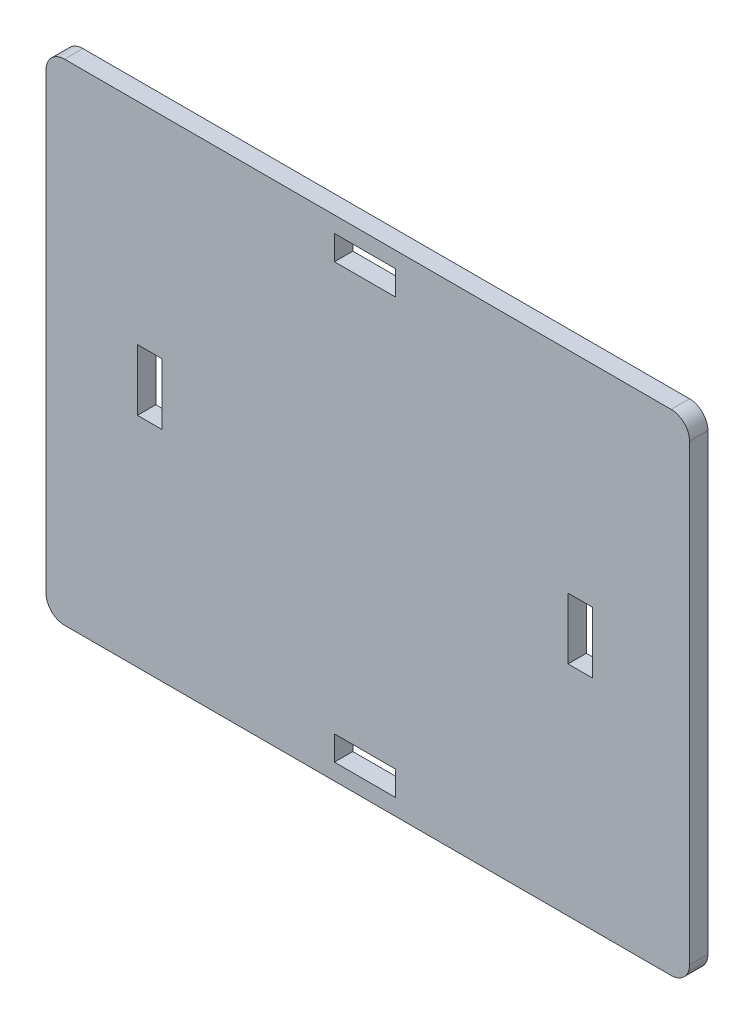
ISO-10303-21;
HEADER;
FILE_DESCRIPTION(('STEP AP214'),'2;1');
FILE_NAME('part.step','',(''),(''),'','','');
FILE_SCHEMA(('AUTOMOTIVE_DESIGN { 1 0 10303 214 1 1 1 1 }'));
ENDSEC;
DATA;
#1=APPLICATION_CONTEXT('core data for automotive mechanical design processes');
#2=APPLICATION_PROTOCOL_DEFINITION('international standard','automotive_design',2000,#1);
#3=PRODUCT_CONTEXT('',#1,'mechanical');
#4=PRODUCT('Part','Part','',(#3));
#5=PRODUCT_RELATED_PRODUCT_CATEGORY('part','',(#4));
#6=PRODUCT_DEFINITION_FORMATION('','',#4);
#7=PRODUCT_DEFINITION_CONTEXT('part definition',#1,'design');
#8=PRODUCT_DEFINITION('design','',#6,#7);
#9=PRODUCT_DEFINITION_SHAPE('','',#8);
#10=(LENGTH_UNIT() NAMED_UNIT(*) SI_UNIT(.MILLI.,.METRE.));
#11=(NAMED_UNIT(*) PLANE_ANGLE_UNIT() SI_UNIT($,.RADIAN.));
#12=(NAMED_UNIT(*) SI_UNIT($,.STERADIAN.) SOLID_ANGLE_UNIT());
#13=UNCERTAINTY_MEASURE_WITH_UNIT(LENGTH_MEASURE(1.E-05),#10,'distance_accuracy_value','');
#14=(GEOMETRIC_REPRESENTATION_CONTEXT(3) GLOBAL_UNCERTAINTY_ASSIGNED_CONTEXT((#13)) GLOBAL_UNIT_ASSIGNED_CONTEXT((#10,
#11,#12)) REPRESENTATION_CONTEXT('',''));
#15=CARTESIAN_POINT('',(0.,0.,0.));
#16=DIRECTION('',(0.,0.,1.));
#17=DIRECTION('',(1.,0.,0.));
#18=AXIS2_PLACEMENT_3D('',#15,#16,#17);
#19=CARTESIAN_POINT('',(-52.5,-40.,3.));
#20=DIRECTION('',(1.,0.,0.));
#21=DIRECTION('',(0.,0.,-1.));
#22=AXIS2_PLACEMENT_3D('',#19,#20,#21);
#23=PLANE('',#22);
#24=DIRECTION('',(0.,-1.,0.));
#25=VECTOR('',#24,1.);
#26=CARTESIAN_POINT('',(-52.5,-40.,3.));
#27=LINE('',#26,#25);
#28=CARTESIAN_POINT('',(-52.5,37.,3.));
#29=VERTEX_POINT('',#28);
#30=CARTESIAN_POINT('',(-52.5,-37.,3.));
#31=VERTEX_POINT('',#30);
#32=EDGE_CURVE('E319',#29,#31,#27,.T.);
#33=ORIENTED_EDGE('',*,*,#32,.F.);
#34=DIRECTION('',(0.,0.,-1.));
#35=VECTOR('',#34,1.);
#36=CARTESIAN_POINT('',(-52.5,37.,3.));
#37=LINE('',#36,#35);
#38=CARTESIAN_POINT('',(-52.5,37.,0.));
#39=VERTEX_POINT('',#38);
#40=EDGE_CURVE('E393',#29,#39,#37,.T.);
#41=ORIENTED_EDGE('',*,*,#40,.T.);
#42=DIRECTION('',(0.,-1.,0.));
#43=VECTOR('',#42,1.);
#44=CARTESIAN_POINT('',(-52.5,-40.,0.));
#45=LINE('',#44,#43);
#46=CARTESIAN_POINT('',(-52.5,-37.,0.));
#47=VERTEX_POINT('',#46);
#48=EDGE_CURVE('E320',#39,#47,#45,.T.);
#49=ORIENTED_EDGE('',*,*,#48,.T.);
#50=DIRECTION('',(0.,0.,-1.));
#51=VECTOR('',#50,1.);
#52=CARTESIAN_POINT('',(-52.5,-37.,3.));
#53=LINE('',#52,#51);
#54=EDGE_CURVE('E386',#47,#31,#53,.F.);
#55=ORIENTED_EDGE('',*,*,#54,.T.);
#56=EDGE_LOOP('',(#33,#41,#49,#55));
#57=FACE_BOUND('',#56,.T.);
#58=ADVANCED_FACE('F39',(#57),#23,.F.);
#59=CARTESIAN_POINT('',(52.5,-40.,3.));
#60=DIRECTION('',(0.,1.,0.));
#61=DIRECTION('',(-1.,0.,0.));
#62=AXIS2_PLACEMENT_3D('',#59,#60,#61);
#63=PLANE('',#62);
#64=DIRECTION('',(1.,0.,0.));
#65=VECTOR('',#64,1.);
#66=CARTESIAN_POINT('',(52.5,-40.,0.));
#67=LINE('',#66,#65);
#68=CARTESIAN_POINT('',(-49.5,-40.,0.));
#69=VERTEX_POINT('',#68);
#70=CARTESIAN_POINT('',(49.5,-40.,0.));
#71=VERTEX_POINT('',#70);
#72=EDGE_CURVE('E335',#69,#71,#67,.T.);
#73=ORIENTED_EDGE('',*,*,#72,.T.);
#74=DIRECTION('',(0.,0.,-1.));
#75=VECTOR('',#74,1.);
#76=CARTESIAN_POINT('',(49.5,-40.,3.));
#77=LINE('',#76,#75);
#78=CARTESIAN_POINT('',(49.5,-40.,3.));
#79=VERTEX_POINT('',#78);
#80=EDGE_CURVE('E11',#71,#79,#77,.F.);
#81=ORIENTED_EDGE('',*,*,#80,.T.);
#82=DIRECTION('',(1.,0.,0.));
#83=VECTOR('',#82,1.);
#84=CARTESIAN_POINT('',(52.5,-40.,3.));
#85=LINE('',#84,#83);
#86=CARTESIAN_POINT('',(-49.5,-40.,3.));
#87=VERTEX_POINT('',#86);
#88=EDGE_CURVE('E325',#87,#79,#85,.T.);
#89=ORIENTED_EDGE('',*,*,#88,.F.);
#90=DIRECTION('',(0.,0.,-1.));
#91=VECTOR('',#90,1.);
#92=CARTESIAN_POINT('',(-49.5,-40.,3.));
#93=LINE('',#92,#91);
#94=EDGE_CURVE('E382',#87,#69,#93,.T.);
#95=ORIENTED_EDGE('',*,*,#94,.T.);
#96=EDGE_LOOP('',(#73,#81,#89,#95));
#97=FACE_BOUND('',#96,.T.);
#98=ADVANCED_FACE('F443',(#97),#63,.F.);
#99=CARTESIAN_POINT('',(52.5,-40.,3.));
#100=DIRECTION('',(-1.,0.,0.));
#101=DIRECTION('',(0.,0.,1.));
#102=AXIS2_PLACEMENT_3D('',#99,#100,#101);
#103=PLANE('',#102);
#104=DIRECTION('',(0.,1.,0.));
#105=VECTOR('',#104,1.);
#106=CARTESIAN_POINT('',(52.5,-40.,0.));
#107=LINE('',#106,#105);
#108=CARTESIAN_POINT('',(52.5,-37.,0.));
#109=VERTEX_POINT('',#108);
#110=CARTESIAN_POINT('',(52.5,37.,0.));
#111=VERTEX_POINT('',#110);
#112=EDGE_CURVE('E333',#109,#111,#107,.T.);
#113=ORIENTED_EDGE('',*,*,#112,.T.);
#114=DIRECTION('',(0.,0.,-1.));
#115=VECTOR('',#114,1.);
#116=CARTESIAN_POINT('',(52.5,37.,3.));
#117=LINE('',#116,#115);
#118=CARTESIAN_POINT('',(52.5,37.,3.));
#119=VERTEX_POINT('',#118);
#120=EDGE_CURVE('E50',#111,#119,#117,.F.);
#121=ORIENTED_EDGE('',*,*,#120,.T.);
#122=DIRECTION('',(0.,1.,0.));
#123=VECTOR('',#122,1.);
#124=CARTESIAN_POINT('',(52.5,-40.,3.));
#125=LINE('',#124,#123);
#126=CARTESIAN_POINT('',(52.5,-37.,3.));
#127=VERTEX_POINT('',#126);
#128=EDGE_CURVE('E324',#127,#119,#125,.T.);
#129=ORIENTED_EDGE('',*,*,#128,.F.);
#130=DIRECTION('',(0.,0.,-1.));
#131=VECTOR('',#130,1.);
#132=CARTESIAN_POINT('',(52.5,-37.,3.));
#133=LINE('',#132,#131);
#134=EDGE_CURVE('E415',#127,#109,#133,.T.);
#135=ORIENTED_EDGE('',*,*,#134,.T.);
#136=EDGE_LOOP('',(#113,#121,#129,#135));
#137=FACE_BOUND('',#136,.T.);
#138=ADVANCED_FACE('F417',(#137),#103,.F.);
#139=CARTESIAN_POINT('',(52.5,40.,3.));
#140=DIRECTION('',(0.,-1.,0.));
#141=DIRECTION('',(1.,0.,0.));
#142=AXIS2_PLACEMENT_3D('',#139,#140,#141);
#143=PLANE('',#142);
#144=DIRECTION('',(-1.,0.,0.));
#145=VECTOR('',#144,1.);
#146=CARTESIAN_POINT('',(52.5,40.,0.));
#147=LINE('',#146,#145);
#148=CARTESIAN_POINT('',(49.5,40.,0.));
#149=VERTEX_POINT('',#148);
#150=CARTESIAN_POINT('',(-49.5,40.,0.));
#151=VERTEX_POINT('',#150);
#152=EDGE_CURVE('E323',#149,#151,#147,.T.);
#153=ORIENTED_EDGE('',*,*,#152,.T.);
#154=DIRECTION('',(0.,0.,-1.));
#155=VECTOR('',#154,1.);
#156=CARTESIAN_POINT('',(-49.5,40.,3.));
#157=LINE('',#156,#155);
#158=CARTESIAN_POINT('',(-49.5,40.,3.));
#159=VERTEX_POINT('',#158);
#160=EDGE_CURVE('E406',#151,#159,#157,.F.);
#161=ORIENTED_EDGE('',*,*,#160,.T.);
#162=DIRECTION('',(-1.,0.,0.));
#163=VECTOR('',#162,1.);
#164=CARTESIAN_POINT('',(52.5,40.,3.));
#165=LINE('',#164,#163);
#166=CARTESIAN_POINT('',(49.5,40.,3.));
#167=VERTEX_POINT('',#166);
#168=EDGE_CURVE('E330',#167,#159,#165,.T.);
#169=ORIENTED_EDGE('',*,*,#168,.F.);
#170=DIRECTION('',(0.,0.,-1.));
#171=VECTOR('',#170,1.);
#172=CARTESIAN_POINT('',(49.5,40.,3.));
#173=LINE('',#172,#171);
#174=EDGE_CURVE('E401',#167,#149,#173,.T.);
#175=ORIENTED_EDGE('',*,*,#174,.T.);
#176=EDGE_LOOP('',(#153,#161,#169,#175));
#177=FACE_BOUND('',#176,.T.);
#178=ADVANCED_FACE('F429',(#177),#143,.F.);
#179=CARTESIAN_POINT('',(0.,0.,3.));
#180=DIRECTION('',(0.,0.,1.));
#181=DIRECTION('',(1.,0.,0.));
#182=AXIS2_PLACEMENT_3D('',#179,#180,#181);
#183=PLANE('',#182);
#184=DIRECTION('',(0.,-1.,0.));
#185=VECTOR('',#184,1.);
#186=CARTESIAN_POINT('',(-5.44629631480209,37.3891384599099,3.));
#187=LINE('',#186,#185);
#188=CARTESIAN_POINT('',(-5.44629631480209,37.3891384599099,3.));
#189=VERTEX_POINT('',#188);
#190=CARTESIAN_POINT('',(-5.44629631480209,33.3891384599099,3.));
#191=VERTEX_POINT('',#190);
#192=EDGE_CURVE('E222',#189,#191,#187,.T.);
#193=ORIENTED_EDGE('',*,*,#192,.F.);
#194=DIRECTION('',(-1.,0.,0.));
#195=VECTOR('',#194,1.);
#196=CARTESIAN_POINT('',(4.55370368519791,37.3891384599099,3.));
#197=LINE('',#196,#195);
#198=CARTESIAN_POINT('',(4.55370368519791,37.3891384599099,3.));
#199=VERTEX_POINT('',#198);
#200=EDGE_CURVE('E226',#199,#189,#197,.T.);
#201=ORIENTED_EDGE('',*,*,#200,.F.);
#202=DIRECTION('',(0.,1.,0.));
#203=VECTOR('',#202,1.);
#204=CARTESIAN_POINT('',(4.55370368519791,37.3891384599099,3.));
#205=LINE('',#204,#203);
#206=CARTESIAN_POINT('',(4.55370368519791,33.3891384599099,3.));
#207=VERTEX_POINT('',#206);
#208=EDGE_CURVE('E202',#207,#199,#205,.T.);
#209=ORIENTED_EDGE('',*,*,#208,.F.);
#210=DIRECTION('',(1.,0.,0.));
#211=VECTOR('',#210,1.);
#212=CARTESIAN_POINT('',(4.55370368519791,33.3891384599099,3.));
#213=LINE('',#212,#211);
#214=EDGE_CURVE('E216',#191,#207,#213,.T.);
#215=ORIENTED_EDGE('',*,*,#214,.F.);
#216=EDGE_LOOP('',(#193,#201,#209,#215));
#217=FACE_BOUND('',#216,.T.);
#218=DIRECTION('',(0.,1.,0.));
#219=VECTOR('',#218,1.);
#220=CARTESIAN_POINT('',(4.55370368519791,-33.3245421024578,3.));
#221=LINE('',#220,#219);
#222=CARTESIAN_POINT('',(4.55370368519791,-37.3245421024578,3.));
#223=VERTEX_POINT('',#222);
#224=CARTESIAN_POINT('',(4.55370368519791,-33.3245421024578,3.));
#225=VERTEX_POINT('',#224);
#226=EDGE_CURVE('E254',#223,#225,#221,.T.);
#227=ORIENTED_EDGE('',*,*,#226,.F.);
#228=DIRECTION('',(1.,0.,0.));
#229=VECTOR('',#228,1.);
#230=CARTESIAN_POINT('',(-5.44629631480209,-37.3245421024578,3.));
#231=LINE('',#230,#229);
#232=CARTESIAN_POINT('',(-5.44629631480209,-37.3245421024578,3.));
#233=VERTEX_POINT('',#232);
#234=EDGE_CURVE('E239',#233,#223,#231,.T.);
#235=ORIENTED_EDGE('',*,*,#234,.F.);
#236=DIRECTION('',(0.,-1.,0.));
#237=VECTOR('',#236,1.);
#238=CARTESIAN_POINT('',(-5.44629631480209,-33.3245421024578,3.));
#239=LINE('',#238,#237);
#240=CARTESIAN_POINT('',(-5.44629631480209,-33.3245421024578,3.));
#241=VERTEX_POINT('',#240);
#242=EDGE_CURVE('E248',#241,#233,#239,.T.);
#243=ORIENTED_EDGE('',*,*,#242,.F.);
#244=DIRECTION('',(-1.,0.,0.));
#245=VECTOR('',#244,1.);
#246=CARTESIAN_POINT('',(-5.44629631480209,-33.3245421024578,3.));
#247=LINE('',#246,#245);
#248=EDGE_CURVE('E252',#225,#241,#247,.T.);
#249=ORIENTED_EDGE('',*,*,#248,.F.);
#250=EDGE_LOOP('',(#227,#235,#243,#249));
#251=FACE_BOUND('',#250,.T.);
#252=DIRECTION('',(0.,-1.,0.));
#253=VECTOR('',#252,1.);
#254=CARTESIAN_POINT('',(-37.5868104083679,5.61767180514039,3.));
#255=LINE('',#254,#253);
#256=CARTESIAN_POINT('',(-37.5868104083679,5.61767180514039,3.));
#257=VERTEX_POINT('',#256);
#258=CARTESIAN_POINT('',(-37.5868104083679,-4.38232819485961,3.));
#259=VERTEX_POINT('',#258);
#260=EDGE_CURVE('E249',#257,#259,#255,.T.);
#261=ORIENTED_EDGE('',*,*,#260,.F.);
#262=DIRECTION('',(-1.,0.,0.));
#263=VECTOR('',#262,1.);
#264=CARTESIAN_POINT('',(-33.5868104083679,5.61767180514039,3.));
#265=LINE('',#264,#263);
#266=CARTESIAN_POINT('',(-33.5868104083679,5.61767180514039,3.));
#267=VERTEX_POINT('',#266);
#268=EDGE_CURVE('E257',#267,#257,#265,.T.);
#269=ORIENTED_EDGE('',*,*,#268,.F.);
#270=DIRECTION('',(0.,1.,0.));
#271=VECTOR('',#270,1.);
#272=CARTESIAN_POINT('',(-33.5868104083679,5.61767180514039,3.));
#273=LINE('',#272,#271);
#274=CARTESIAN_POINT('',(-33.5868104083679,-4.38232819485961,3.));
#275=VERTEX_POINT('',#274);
#276=EDGE_CURVE('E269',#275,#267,#273,.T.);
#277=ORIENTED_EDGE('',*,*,#276,.F.);
#278=DIRECTION('',(1.,0.,0.));
#279=VECTOR('',#278,1.);
#280=CARTESIAN_POINT('',(-33.5868104083679,-4.38232819485961,3.));
#281=LINE('',#280,#279);
#282=EDGE_CURVE('E272',#259,#275,#281,.T.);
#283=ORIENTED_EDGE('',*,*,#282,.F.);
#284=EDGE_LOOP('',(#261,#269,#277,#283));
#285=FACE_BOUND('',#284,.T.);
#286=DIRECTION('',(0.,-1.,0.));
#287=VECTOR('',#286,1.);
#288=CARTESIAN_POINT('',(32.6692984027353,-4.38232819485961,3.));
#289=LINE('',#288,#287);
#290=CARTESIAN_POINT('',(32.6692984027353,5.61767180514039,3.));
#291=VERTEX_POINT('',#290);
#292=CARTESIAN_POINT('',(32.6692984027353,-4.38232819485961,3.));
#293=VERTEX_POINT('',#292);
#294=EDGE_CURVE('E270',#291,#293,#289,.T.);
#295=ORIENTED_EDGE('',*,*,#294,.F.);
#296=DIRECTION('',(-1.,0.,0.));
#297=VECTOR('',#296,1.);
#298=CARTESIAN_POINT('',(36.6692984027353,5.61767180514039,3.));
#299=LINE('',#298,#297);
#300=CARTESIAN_POINT('',(36.6692984027353,5.61767180514039,3.));
#301=VERTEX_POINT('',#300);
#302=EDGE_CURVE('E278',#301,#291,#299,.T.);
#303=ORIENTED_EDGE('',*,*,#302,.F.);
#304=DIRECTION('',(0.,1.,0.));
#305=VECTOR('',#304,1.);
#306=CARTESIAN_POINT('',(36.6692984027353,-4.38232819485961,3.));
#307=LINE('',#306,#305);
#308=CARTESIAN_POINT('',(36.6692984027353,-4.38232819485961,3.));
#309=VERTEX_POINT('',#308);
#310=EDGE_CURVE('E288',#309,#301,#307,.T.);
#311=ORIENTED_EDGE('',*,*,#310,.F.);
#312=DIRECTION('',(1.,0.,0.));
#313=VECTOR('',#312,1.);
#314=CARTESIAN_POINT('',(36.6692984027353,-4.38232819485961,3.));
#315=LINE('',#314,#313);
#316=EDGE_CURVE('E295',#293,#309,#315,.T.);
#317=ORIENTED_EDGE('',*,*,#316,.F.);
#318=EDGE_LOOP('',(#295,#303,#311,#317));
#319=FACE_BOUND('',#318,.T.);
#320=ORIENTED_EDGE('',*,*,#168,.T.);
#321=CARTESIAN_POINT('',(-49.5,37.,3.));
#322=DIRECTION('',(0.,0.,1.));
#323=DIRECTION('',(1.,0.,0.));
#324=AXIS2_PLACEMENT_3D('',#321,#322,#323);
#325=CIRCLE('',#324,3.);
#326=EDGE_CURVE('E414',#159,#29,#325,.T.);
#327=ORIENTED_EDGE('',*,*,#326,.T.);
#328=ORIENTED_EDGE('',*,*,#32,.T.);
#329=CARTESIAN_POINT('',(-49.5,-37.,3.));
#330=DIRECTION('',(0.,0.,1.));
#331=DIRECTION('',(1.,0.,0.));
#332=AXIS2_PLACEMENT_3D('',#329,#330,#331);
#333=CIRCLE('',#332,3.);
#334=EDGE_CURVE('E395',#31,#87,#333,.T.);
#335=ORIENTED_EDGE('',*,*,#334,.T.);
#336=ORIENTED_EDGE('',*,*,#88,.T.);
#337=CARTESIAN_POINT('',(49.5,-37.,3.));
#338=DIRECTION('',(0.,0.,1.));
#339=DIRECTION('',(1.,0.,0.));
#340=AXIS2_PLACEMENT_3D('',#337,#338,#339);
#341=CIRCLE('',#340,3.);
#342=EDGE_CURVE('E58',#79,#127,#341,.T.);
#343=ORIENTED_EDGE('',*,*,#342,.T.);
#344=ORIENTED_EDGE('',*,*,#128,.T.);
#345=CARTESIAN_POINT('',(49.5,37.,3.));
#346=DIRECTION('',(0.,0.,1.));
#347=DIRECTION('',(1.,0.,0.));
#348=AXIS2_PLACEMENT_3D('',#345,#346,#347);
#349=CIRCLE('',#348,3.);
#350=EDGE_CURVE('E408',#119,#167,#349,.T.);
#351=ORIENTED_EDGE('',*,*,#350,.T.);
#352=EDGE_LOOP('',(#320,#327,#328,#335,#336,#343,#344,#351));
#353=FACE_BOUND('',#352,.T.);
#354=ADVANCED_FACE('F224',(#217,#251,#285,#319,#353),#183,.T.);
#355=CARTESIAN_POINT('',(0.,0.,0.));
#356=DIRECTION('',(0.,0.,1.));
#357=DIRECTION('',(1.,0.,0.));
#358=AXIS2_PLACEMENT_3D('',#355,#356,#357);
#359=PLANE('',#358);
#360=DIRECTION('',(-1.,0.,0.));
#361=VECTOR('',#360,1.);
#362=CARTESIAN_POINT('',(0.,37.3891384599099,0.));
#363=LINE('',#362,#361);
#364=CARTESIAN_POINT('',(4.55370368519791,37.3891384599099,0.));
#365=VERTEX_POINT('',#364);
#366=CARTESIAN_POINT('',(-5.44629631480209,37.3891384599099,0.));
#367=VERTEX_POINT('',#366);
#368=EDGE_CURVE('E380',#365,#367,#363,.T.);
#369=ORIENTED_EDGE('',*,*,#368,.T.);
#370=DIRECTION('',(0.,-1.,0.));
#371=VECTOR('',#370,1.);
#372=CARTESIAN_POINT('',(-5.4462963148021,0.,0.));
#373=LINE('',#372,#371);
#374=CARTESIAN_POINT('',(-5.44629631480209,33.3891384599099,0.));
#375=VERTEX_POINT('',#374);
#376=EDGE_CURVE('E379',#367,#375,#373,.T.);
#377=ORIENTED_EDGE('',*,*,#376,.T.);
#378=DIRECTION('',(1.,0.,0.));
#379=VECTOR('',#378,1.);
#380=CARTESIAN_POINT('',(0.,33.3891384599099,0.));
#381=LINE('',#380,#379);
#382=CARTESIAN_POINT('',(4.55370368519791,33.3891384599099,0.));
#383=VERTEX_POINT('',#382);
#384=EDGE_CURVE('E372',#375,#383,#381,.T.);
#385=ORIENTED_EDGE('',*,*,#384,.T.);
#386=DIRECTION('',(0.,1.,0.));
#387=VECTOR('',#386,1.);
#388=CARTESIAN_POINT('',(4.55370368519791,0.,0.));
#389=LINE('',#388,#387);
#390=EDGE_CURVE('E208',#383,#365,#389,.T.);
#391=ORIENTED_EDGE('',*,*,#390,.T.);
#392=EDGE_LOOP('',(#369,#377,#385,#391));
#393=FACE_BOUND('',#392,.T.);
#394=DIRECTION('',(1.,0.,0.));
#395=VECTOR('',#394,1.);
#396=CARTESIAN_POINT('',(0.,-37.3245421024578,0.));
#397=LINE('',#396,#395);
#398=CARTESIAN_POINT('',(-5.44629631480209,-37.3245421024578,0.));
#399=VERTEX_POINT('',#398);
#400=CARTESIAN_POINT('',(4.55370368519791,-37.3245421024578,0.));
#401=VERTEX_POINT('',#400);
#402=EDGE_CURVE('E366',#399,#401,#397,.T.);
#403=ORIENTED_EDGE('',*,*,#402,.T.);
#404=DIRECTION('',(0.,1.,0.));
#405=VECTOR('',#404,1.);
#406=CARTESIAN_POINT('',(4.5537036851979,0.,0.));
#407=LINE('',#406,#405);
#408=CARTESIAN_POINT('',(4.55370368519791,-33.3245421024578,0.));
#409=VERTEX_POINT('',#408);
#410=EDGE_CURVE('E371',#401,#409,#407,.T.);
#411=ORIENTED_EDGE('',*,*,#410,.T.);
#412=DIRECTION('',(-1.,0.,0.));
#413=VECTOR('',#412,1.);
#414=CARTESIAN_POINT('',(0.,-33.3245421024578,0.));
#415=LINE('',#414,#413);
#416=CARTESIAN_POINT('',(-5.44629631480209,-33.3245421024578,0.));
#417=VERTEX_POINT('',#416);
#418=EDGE_CURVE('E362',#409,#417,#415,.T.);
#419=ORIENTED_EDGE('',*,*,#418,.T.);
#420=DIRECTION('',(0.,-1.,0.));
#421=VECTOR('',#420,1.);
#422=CARTESIAN_POINT('',(-5.44629631480211,0.,0.));
#423=LINE('',#422,#421);
#424=EDGE_CURVE('E364',#417,#399,#423,.T.);
#425=ORIENTED_EDGE('',*,*,#424,.T.);
#426=EDGE_LOOP('',(#403,#411,#419,#425));
#427=FACE_BOUND('',#426,.T.);
#428=DIRECTION('',(-1.,0.,0.));
#429=VECTOR('',#428,1.);
#430=CARTESIAN_POINT('',(0.,5.6176718051404,0.));
#431=LINE('',#430,#429);
#432=CARTESIAN_POINT('',(-33.5868104083679,5.61767180514039,0.));
#433=VERTEX_POINT('',#432);
#434=CARTESIAN_POINT('',(-37.5868104083679,5.61767180514039,0.));
#435=VERTEX_POINT('',#434);
#436=EDGE_CURVE('E359',#433,#435,#431,.T.);
#437=ORIENTED_EDGE('',*,*,#436,.T.);
#438=DIRECTION('',(0.,-1.,0.));
#439=VECTOR('',#438,1.);
#440=CARTESIAN_POINT('',(-37.5868104083679,0.,0.));
#441=LINE('',#440,#439);
#442=CARTESIAN_POINT('',(-37.5868104083679,-4.38232819485961,0.));
#443=VERTEX_POINT('',#442);
#444=EDGE_CURVE('E358',#435,#443,#441,.T.);
#445=ORIENTED_EDGE('',*,*,#444,.T.);
#446=DIRECTION('',(1.,0.,0.));
#447=VECTOR('',#446,1.);
#448=CARTESIAN_POINT('',(0.,-4.3823281948596,0.));
#449=LINE('',#448,#447);
#450=CARTESIAN_POINT('',(-33.5868104083679,-4.38232819485961,0.));
#451=VERTEX_POINT('',#450);
#452=EDGE_CURVE('E348',#443,#451,#449,.T.);
#453=ORIENTED_EDGE('',*,*,#452,.T.);
#454=DIRECTION('',(0.,1.,0.));
#455=VECTOR('',#454,1.);
#456=CARTESIAN_POINT('',(-33.5868104083679,0.,0.));
#457=LINE('',#456,#455);
#458=EDGE_CURVE('E352',#451,#433,#457,.T.);
#459=ORIENTED_EDGE('',*,*,#458,.T.);
#460=EDGE_LOOP('',(#437,#445,#453,#459));
#461=FACE_BOUND('',#460,.T.);
#462=DIRECTION('',(-1.,0.,0.));
#463=VECTOR('',#462,1.);
#464=CARTESIAN_POINT('',(0.,5.61767180514038,0.));
#465=LINE('',#464,#463);
#466=CARTESIAN_POINT('',(36.6692984027353,5.61767180514039,0.));
#467=VERTEX_POINT('',#466);
#468=CARTESIAN_POINT('',(32.6692984027353,5.61767180514039,0.));
#469=VERTEX_POINT('',#468);
#470=EDGE_CURVE('E343',#467,#469,#465,.T.);
#471=ORIENTED_EDGE('',*,*,#470,.T.);
#472=DIRECTION('',(0.,-1.,0.));
#473=VECTOR('',#472,1.);
#474=CARTESIAN_POINT('',(32.6692984027353,0.,0.));
#475=LINE('',#474,#473);
#476=CARTESIAN_POINT('',(32.6692984027353,-4.38232819485961,0.));
#477=VERTEX_POINT('',#476);
#478=EDGE_CURVE('E350',#469,#477,#475,.T.);
#479=ORIENTED_EDGE('',*,*,#478,.T.);
#480=DIRECTION('',(1.,0.,0.));
#481=VECTOR('',#480,1.);
#482=CARTESIAN_POINT('',(0.,-4.38232819485962,0.));
#483=LINE('',#482,#481);
#484=CARTESIAN_POINT('',(36.6692984027353,-4.38232819485961,0.));
#485=VERTEX_POINT('',#484);
#486=EDGE_CURVE('E329',#477,#485,#483,.T.);
#487=ORIENTED_EDGE('',*,*,#486,.T.);
#488=DIRECTION('',(0.,1.,0.));
#489=VECTOR('',#488,1.);
#490=CARTESIAN_POINT('',(36.6692984027353,0.,0.));
#491=LINE('',#490,#489);
#492=EDGE_CURVE('E344',#485,#467,#491,.T.);
#493=ORIENTED_EDGE('',*,*,#492,.T.);
#494=EDGE_LOOP('',(#471,#479,#487,#493));
#495=FACE_BOUND('',#494,.T.);
#496=CARTESIAN_POINT('',(24.509514805714,-24.5095148057139,0.));
#497=DIRECTION('',(0.,0.,-1.));
#498=DIRECTION('',(-1.,0.,0.));
#499=AXIS2_PLACEMENT_3D('',#496,#497,#498);
#500=CIRCLE('',#499,3.75);
#501=CARTESIAN_POINT('',(20.759514805714,-24.5095148057139,0.));
#502=VERTEX_POINT('',#501);
#503=EDGE_CURVE('E310',#502,#502,#500,.T.);
#504=ORIENTED_EDGE('',*,*,#503,.F.);
#505=EDGE_LOOP('',(#504));
#506=FACE_BOUND('',#505,.T.);
#507=CARTESIAN_POINT('',(-24.509514805714,-24.5095148057139,0.));
#508=DIRECTION('',(0.,0.,-1.));
#509=DIRECTION('',(-1.,0.,0.));
#510=AXIS2_PLACEMENT_3D('',#507,#508,#509);
#511=CIRCLE('',#510,3.75);
#512=CARTESIAN_POINT('',(-28.259514805714,-24.5095148057139,0.));
#513=VERTEX_POINT('',#512);
#514=EDGE_CURVE('E305',#513,#513,#511,.T.);
#515=ORIENTED_EDGE('',*,*,#514,.F.);
#516=EDGE_LOOP('',(#515));
#517=FACE_BOUND('',#516,.T.);
#518=CARTESIAN_POINT('',(-24.5095148057141,24.5095148057141,0.));
#519=DIRECTION('',(0.,0.,-1.));
#520=DIRECTION('',(-1.,0.,0.));
#521=AXIS2_PLACEMENT_3D('',#518,#519,#520);
#522=CIRCLE('',#521,3.75);
#523=CARTESIAN_POINT('',(-28.2595148057141,24.5095148057141,0.));
#524=VERTEX_POINT('',#523);
#525=EDGE_CURVE('E296',#524,#524,#522,.T.);
#526=ORIENTED_EDGE('',*,*,#525,.F.);
#527=EDGE_LOOP('',(#526));
#528=FACE_BOUND('',#527,.T.);
#529=CARTESIAN_POINT('',(24.5095148057141,24.5095148057141,0.));
#530=DIRECTION('',(0.,0.,-1.));
#531=DIRECTION('',(-1.,0.,0.));
#532=AXIS2_PLACEMENT_3D('',#529,#530,#531);
#533=CIRCLE('',#532,3.75);
#534=CARTESIAN_POINT('',(20.7595148057141,24.5095148057141,0.));
#535=VERTEX_POINT('',#534);
#536=EDGE_CURVE('E298',#535,#535,#533,.T.);
#537=ORIENTED_EDGE('',*,*,#536,.F.);
#538=EDGE_LOOP('',(#537));
#539=FACE_BOUND('',#538,.T.);
#540=ORIENTED_EDGE('',*,*,#48,.F.);
#541=CARTESIAN_POINT('',(-49.5,37.,0.));
#542=DIRECTION('',(0.,0.,1.));
#543=DIRECTION('',(1.,0.,0.));
#544=AXIS2_PLACEMENT_3D('',#541,#542,#543);
#545=CIRCLE('',#544,3.);
#546=EDGE_CURVE('E402',#39,#151,#545,.F.);
#547=ORIENTED_EDGE('',*,*,#546,.T.);
#548=ORIENTED_EDGE('',*,*,#152,.F.);
#549=CARTESIAN_POINT('',(49.5,37.,0.));
#550=DIRECTION('',(0.,0.,1.));
#551=DIRECTION('',(1.,0.,0.));
#552=AXIS2_PLACEMENT_3D('',#549,#550,#551);
#553=CIRCLE('',#552,3.);
#554=EDGE_CURVE('E398',#149,#111,#553,.F.);
#555=ORIENTED_EDGE('',*,*,#554,.T.);
#556=ORIENTED_EDGE('',*,*,#112,.F.);
#557=CARTESIAN_POINT('',(49.5,-37.,0.));
#558=DIRECTION('',(0.,0.,1.));
#559=DIRECTION('',(1.,0.,0.));
#560=AXIS2_PLACEMENT_3D('',#557,#558,#559);
#561=CIRCLE('',#560,3.);
#562=EDGE_CURVE('E396',#109,#71,#561,.F.);
#563=ORIENTED_EDGE('',*,*,#562,.T.);
#564=ORIENTED_EDGE('',*,*,#72,.F.);
#565=CARTESIAN_POINT('',(-49.5,-37.,0.));
#566=DIRECTION('',(0.,0.,1.));
#567=DIRECTION('',(1.,0.,0.));
#568=AXIS2_PLACEMENT_3D('',#565,#566,#567);
#569=CIRCLE('',#568,3.);
#570=EDGE_CURVE('E387',#69,#47,#569,.F.);
#571=ORIENTED_EDGE('',*,*,#570,.T.);
#572=EDGE_LOOP('',(#540,#547,#548,#555,#556,#563,#564,#571));
#573=FACE_BOUND('',#572,.T.);
#574=ADVANCED_FACE('F423',(#393,#427,#461,#495,#506,#517,#528,#539,#573),#359,.F.);
#575=CARTESIAN_POINT('',(24.5095148057141,24.5095148057141,2.2));
#576=DIRECTION('',(0.,0.,-1.));
#577=DIRECTION('',(-1.,0.,0.));
#578=AXIS2_PLACEMENT_3D('',#575,#576,#577);
#579=CYLINDRICAL_SURFACE('',#578,3.75);
#580=CARTESIAN_POINT('',(24.5095148057141,24.5095148057141,2.2));
#581=DIRECTION('',(0.,0.,-1.));
#582=DIRECTION('',(-1.,0.,0.));
#583=AXIS2_PLACEMENT_3D('',#580,#581,#582);
#584=CIRCLE('',#583,3.75);
#585=CARTESIAN_POINT('',(20.7595148057141,24.5095148057141,2.2));
#586=VERTEX_POINT('',#585);
#587=EDGE_CURVE('E314',#586,#586,#584,.T.);
#588=ORIENTED_EDGE('',*,*,#587,.F.);
#589=EDGE_LOOP('',(#588));
#590=FACE_BOUND('',#589,.T.);
#591=ORIENTED_EDGE('',*,*,#536,.T.);
#592=EDGE_LOOP('',(#591));
#593=FACE_BOUND('',#592,.T.);
#594=ADVANCED_FACE('F686',(#590,#593),#579,.F.);
#595=CARTESIAN_POINT('',(24.5095148057141,24.5095148057141,2.2));
#596=DIRECTION('',(0.,0.,-1.));
#597=DIRECTION('',(-1.,0.,0.));
#598=AXIS2_PLACEMENT_3D('',#595,#596,#597);
#599=PLANE('',#598);
#600=ORIENTED_EDGE('',*,*,#587,.T.);
#601=EDGE_LOOP('',(#600));
#602=FACE_BOUND('',#601,.T.);
#603=ADVANCED_FACE('F676',(#602),#599,.T.);
#604=CARTESIAN_POINT('',(-24.5095148057141,24.5095148057141,2.2));
#605=DIRECTION('',(0.,0.,-1.));
#606=DIRECTION('',(-1.,0.,0.));
#607=AXIS2_PLACEMENT_3D('',#604,#605,#606);
#608=CYLINDRICAL_SURFACE('',#607,3.75);
#609=CARTESIAN_POINT('',(-24.5095148057141,24.5095148057141,2.2));
#610=DIRECTION('',(0.,0.,-1.));
#611=DIRECTION('',(-1.,0.,0.));
#612=AXIS2_PLACEMENT_3D('',#609,#610,#611);
#613=CIRCLE('',#612,3.75);
#614=CARTESIAN_POINT('',(-28.2595148057141,24.5095148057141,2.2));
#615=VERTEX_POINT('',#614);
#616=EDGE_CURVE('E299',#615,#615,#613,.T.);
#617=ORIENTED_EDGE('',*,*,#616,.F.);
#618=EDGE_LOOP('',(#617));
#619=FACE_BOUND('',#618,.T.);
#620=ORIENTED_EDGE('',*,*,#525,.T.);
#621=EDGE_LOOP('',(#620));
#622=FACE_BOUND('',#621,.T.);
#623=ADVANCED_FACE('F668',(#619,#622),#608,.F.);
#624=CARTESIAN_POINT('',(-24.5095148057141,24.5095148057141,2.2));
#625=DIRECTION('',(0.,0.,-1.));
#626=DIRECTION('',(-1.,0.,0.));
#627=AXIS2_PLACEMENT_3D('',#624,#625,#626);
#628=PLANE('',#627);
#629=ORIENTED_EDGE('',*,*,#616,.T.);
#630=EDGE_LOOP('',(#629));
#631=FACE_BOUND('',#630,.T.);
#632=ADVANCED_FACE('F659',(#631),#628,.T.);
#633=CARTESIAN_POINT('',(-24.509514805714,-24.5095148057139,2.2));
#634=DIRECTION('',(0.,0.,-1.));
#635=DIRECTION('',(-1.,0.,0.));
#636=AXIS2_PLACEMENT_3D('',#633,#634,#635);
#637=CYLINDRICAL_SURFACE('',#636,3.75);
#638=CARTESIAN_POINT('',(-24.509514805714,-24.5095148057139,2.2));
#639=DIRECTION('',(0.,0.,-1.));
#640=DIRECTION('',(-1.,0.,0.));
#641=AXIS2_PLACEMENT_3D('',#638,#639,#640);
#642=CIRCLE('',#641,3.75);
#643=CARTESIAN_POINT('',(-28.259514805714,-24.5095148057139,2.2));
#644=VERTEX_POINT('',#643);
#645=EDGE_CURVE('E308',#644,#644,#642,.T.);
#646=ORIENTED_EDGE('',*,*,#645,.F.);
#647=EDGE_LOOP('',(#646));
#648=FACE_BOUND('',#647,.T.);
#649=ORIENTED_EDGE('',*,*,#514,.T.);
#650=EDGE_LOOP('',(#649));
#651=FACE_BOUND('',#650,.T.);
#652=ADVANCED_FACE('F651',(#648,#651),#637,.F.);
#653=CARTESIAN_POINT('',(-24.509514805714,-24.5095148057139,2.2));
#654=DIRECTION('',(0.,0.,-1.));
#655=DIRECTION('',(-1.,0.,0.));
#656=AXIS2_PLACEMENT_3D('',#653,#654,#655);
#657=PLANE('',#656);
#658=ORIENTED_EDGE('',*,*,#645,.T.);
#659=EDGE_LOOP('',(#658));
#660=FACE_BOUND('',#659,.T.);
#661=ADVANCED_FACE('F645',(#660),#657,.T.);
#662=CARTESIAN_POINT('',(24.509514805714,-24.5095148057139,2.2));
#663=DIRECTION('',(0.,0.,-1.));
#664=DIRECTION('',(-1.,0.,0.));
#665=AXIS2_PLACEMENT_3D('',#662,#663,#664);
#666=CYLINDRICAL_SURFACE('',#665,3.75);
#667=CARTESIAN_POINT('',(24.509514805714,-24.5095148057139,2.2));
#668=DIRECTION('',(0.,0.,-1.));
#669=DIRECTION('',(-1.,0.,0.));
#670=AXIS2_PLACEMENT_3D('',#667,#668,#669);
#671=CIRCLE('',#670,3.75);
#672=CARTESIAN_POINT('',(20.759514805714,-24.5095148057139,2.2));
#673=VERTEX_POINT('',#672);
#674=EDGE_CURVE('E235',#673,#673,#671,.T.);
#675=ORIENTED_EDGE('',*,*,#674,.F.);
#676=EDGE_LOOP('',(#675));
#677=FACE_BOUND('',#676,.T.);
#678=ORIENTED_EDGE('',*,*,#503,.T.);
#679=EDGE_LOOP('',(#678));
#680=FACE_BOUND('',#679,.T.);
#681=ADVANCED_FACE('F635',(#677,#680),#666,.F.);
#682=CARTESIAN_POINT('',(24.509514805714,-24.5095148057139,2.2));
#683=DIRECTION('',(0.,0.,-1.));
#684=DIRECTION('',(-1.,0.,0.));
#685=AXIS2_PLACEMENT_3D('',#682,#683,#684);
#686=PLANE('',#685);
#687=ORIENTED_EDGE('',*,*,#674,.T.);
#688=EDGE_LOOP('',(#687));
#689=FACE_BOUND('',#688,.T.);
#690=ADVANCED_FACE('F624',(#689),#686,.T.);
#691=CARTESIAN_POINT('',(32.6692984027353,-4.38232819485961,-7.));
#692=DIRECTION('',(-1.,0.,0.));
#693=DIRECTION('',(0.,0.,1.));
#694=AXIS2_PLACEMENT_3D('',#691,#692,#693);
#695=PLANE('',#694);
#696=DIRECTION('',(0.,0.,1.));
#697=VECTOR('',#696,1.);
#698=CARTESIAN_POINT('',(32.6692984027353,5.61767180514039,-7.));
#699=LINE('',#698,#697);
#700=EDGE_CURVE('E284',#469,#291,#699,.T.);
#701=ORIENTED_EDGE('',*,*,#700,.T.);
#702=ORIENTED_EDGE('',*,*,#294,.T.);
#703=DIRECTION('',(0.,0.,1.));
#704=VECTOR('',#703,1.);
#705=CARTESIAN_POINT('',(32.6692984027353,-4.38232819485961,-7.));
#706=LINE('',#705,#704);
#707=EDGE_CURVE('E280',#477,#293,#706,.T.);
#708=ORIENTED_EDGE('',*,*,#707,.F.);
#709=ORIENTED_EDGE('',*,*,#478,.F.);
#710=EDGE_LOOP('',(#701,#702,#708,#709));
#711=FACE_BOUND('',#710,.T.);
#712=ADVANCED_FACE('F614',(#711),#695,.F.);
#713=CARTESIAN_POINT('',(36.6692984027353,5.61767180514039,-7.));
#714=DIRECTION('',(0.,1.,0.));
#715=DIRECTION('',(-1.,0.,0.));
#716=AXIS2_PLACEMENT_3D('',#713,#714,#715);
#717=PLANE('',#716);
#718=DIRECTION('',(0.,0.,1.));
#719=VECTOR('',#718,1.);
#720=CARTESIAN_POINT('',(36.6692984027353,5.61767180514039,-7.));
#721=LINE('',#720,#719);
#722=EDGE_CURVE('E282',#467,#301,#721,.T.);
#723=ORIENTED_EDGE('',*,*,#722,.T.);
#724=ORIENTED_EDGE('',*,*,#302,.T.);
#725=ORIENTED_EDGE('',*,*,#700,.F.);
#726=ORIENTED_EDGE('',*,*,#470,.F.);
#727=EDGE_LOOP('',(#723,#724,#725,#726));
#728=FACE_BOUND('',#727,.T.);
#729=ADVANCED_FACE('F607',(#728),#717,.F.);
#730=CARTESIAN_POINT('',(36.6692984027353,-4.38232819485961,-7.));
#731=DIRECTION('',(1.,0.,0.));
#732=DIRECTION('',(0.,0.,-1.));
#733=AXIS2_PLACEMENT_3D('',#730,#731,#732);
#734=PLANE('',#733);
#735=DIRECTION('',(0.,0.,1.));
#736=VECTOR('',#735,1.);
#737=CARTESIAN_POINT('',(36.6692984027353,-4.38232819485961,-7.));
#738=LINE('',#737,#736);
#739=EDGE_CURVE('E281',#485,#309,#738,.T.);
#740=ORIENTED_EDGE('',*,*,#739,.T.);
#741=ORIENTED_EDGE('',*,*,#310,.T.);
#742=ORIENTED_EDGE('',*,*,#722,.F.);
#743=ORIENTED_EDGE('',*,*,#492,.F.);
#744=EDGE_LOOP('',(#740,#741,#742,#743));
#745=FACE_BOUND('',#744,.T.);
#746=ADVANCED_FACE('F600',(#745),#734,.F.);
#747=CARTESIAN_POINT('',(36.6692984027353,-4.38232819485961,-7.));
#748=DIRECTION('',(0.,-1.,0.));
#749=DIRECTION('',(1.,0.,0.));
#750=AXIS2_PLACEMENT_3D('',#747,#748,#749);
#751=PLANE('',#750);
#752=ORIENTED_EDGE('',*,*,#707,.T.);
#753=ORIENTED_EDGE('',*,*,#316,.T.);
#754=ORIENTED_EDGE('',*,*,#739,.F.);
#755=ORIENTED_EDGE('',*,*,#486,.F.);
#756=EDGE_LOOP('',(#752,#753,#754,#755));
#757=FACE_BOUND('',#756,.T.);
#758=ADVANCED_FACE('F586',(#757),#751,.F.);
#759=CARTESIAN_POINT('',(-37.5868104083679,5.61767180514039,-7.));
#760=DIRECTION('',(-1.,0.,0.));
#761=DIRECTION('',(0.,0.,1.));
#762=AXIS2_PLACEMENT_3D('',#759,#760,#761);
#763=PLANE('',#762);
#764=DIRECTION('',(0.,0.,1.));
#765=VECTOR('',#764,1.);
#766=CARTESIAN_POINT('',(-37.5868104083679,5.61767180514039,-7.));
#767=LINE('',#766,#765);
#768=EDGE_CURVE('E264',#435,#257,#767,.T.);
#769=ORIENTED_EDGE('',*,*,#768,.T.);
#770=ORIENTED_EDGE('',*,*,#260,.T.);
#771=DIRECTION('',(0.,0.,1.));
#772=VECTOR('',#771,1.);
#773=CARTESIAN_POINT('',(-37.5868104083679,-4.38232819485961,-7.));
#774=LINE('',#773,#772);
#775=EDGE_CURVE('E260',#443,#259,#774,.T.);
#776=ORIENTED_EDGE('',*,*,#775,.F.);
#777=ORIENTED_EDGE('',*,*,#444,.F.);
#778=EDGE_LOOP('',(#769,#770,#776,#777));
#779=FACE_BOUND('',#778,.T.);
#780=ADVANCED_FACE('F578',(#779),#763,.F.);
#781=CARTESIAN_POINT('',(-33.5868104083679,5.61767180514039,-7.));
#782=DIRECTION('',(0.,1.,0.));
#783=DIRECTION('',(-1.,0.,0.));
#784=AXIS2_PLACEMENT_3D('',#781,#782,#783);
#785=PLANE('',#784);
#786=DIRECTION('',(0.,0.,1.));
#787=VECTOR('',#786,1.);
#788=CARTESIAN_POINT('',(-33.5868104083679,5.61767180514039,-7.));
#789=LINE('',#788,#787);
#790=EDGE_CURVE('E263',#433,#267,#789,.T.);
#791=ORIENTED_EDGE('',*,*,#790,.T.);
#792=ORIENTED_EDGE('',*,*,#268,.T.);
#793=ORIENTED_EDGE('',*,*,#768,.F.);
#794=ORIENTED_EDGE('',*,*,#436,.F.);
#795=EDGE_LOOP('',(#791,#792,#793,#794));
#796=FACE_BOUND('',#795,.T.);
#797=ADVANCED_FACE('F568',(#796),#785,.F.);
#798=CARTESIAN_POINT('',(-33.5868104083679,5.61767180514039,-7.));
#799=DIRECTION('',(1.,0.,0.));
#800=DIRECTION('',(0.,0.,-1.));
#801=AXIS2_PLACEMENT_3D('',#798,#799,#800);
#802=PLANE('',#801);
#803=DIRECTION('',(0.,0.,1.));
#804=VECTOR('',#803,1.);
#805=CARTESIAN_POINT('',(-33.5868104083679,-4.38232819485961,-7.));
#806=LINE('',#805,#804);
#807=EDGE_CURVE('E261',#451,#275,#806,.T.);
#808=ORIENTED_EDGE('',*,*,#807,.T.);
#809=ORIENTED_EDGE('',*,*,#276,.T.);
#810=ORIENTED_EDGE('',*,*,#790,.F.);
#811=ORIENTED_EDGE('',*,*,#458,.F.);
#812=EDGE_LOOP('',(#808,#809,#810,#811));
#813=FACE_BOUND('',#812,.T.);
#814=ADVANCED_FACE('F564',(#813),#802,.F.);
#815=CARTESIAN_POINT('',(-33.5868104083679,-4.38232819485961,-7.));
#816=DIRECTION('',(0.,-1.,0.));
#817=DIRECTION('',(1.,0.,0.));
#818=AXIS2_PLACEMENT_3D('',#815,#816,#817);
#819=PLANE('',#818);
#820=ORIENTED_EDGE('',*,*,#775,.T.);
#821=ORIENTED_EDGE('',*,*,#282,.T.);
#822=ORIENTED_EDGE('',*,*,#807,.F.);
#823=ORIENTED_EDGE('',*,*,#452,.F.);
#824=EDGE_LOOP('',(#820,#821,#822,#823));
#825=FACE_BOUND('',#824,.T.);
#826=ADVANCED_FACE('F555',(#825),#819,.F.);
#827=CARTESIAN_POINT('',(4.55370368519791,-33.3245421024578,-7.));
#828=DIRECTION('',(1.,0.,0.));
#829=DIRECTION('',(0.,1.,0.));
#830=AXIS2_PLACEMENT_3D('',#827,#828,#829);
#831=PLANE('',#830);
#832=DIRECTION('',(0.,0.,1.));
#833=VECTOR('',#832,1.);
#834=CARTESIAN_POINT('',(4.55370368519791,-37.3245421024578,-7.));
#835=LINE('',#834,#833);
#836=EDGE_CURVE('E243',#401,#223,#835,.T.);
#837=ORIENTED_EDGE('',*,*,#836,.T.);
#838=ORIENTED_EDGE('',*,*,#226,.T.);
#839=DIRECTION('',(0.,0.,1.));
#840=VECTOR('',#839,1.);
#841=CARTESIAN_POINT('',(4.55370368519791,-33.3245421024578,-7.));
#842=LINE('',#841,#840);
#843=EDGE_CURVE('E237',#409,#225,#842,.T.);
#844=ORIENTED_EDGE('',*,*,#843,.F.);
#845=ORIENTED_EDGE('',*,*,#410,.F.);
#846=EDGE_LOOP('',(#837,#838,#844,#845));
#847=FACE_BOUND('',#846,.T.);
#848=ADVANCED_FACE('F543',(#847),#831,.F.);
#849=CARTESIAN_POINT('',(-5.44629631480209,-37.3245421024578,-7.));
#850=DIRECTION('',(0.,-1.,0.));
#851=DIRECTION('',(0.,0.,-1.));
#852=AXIS2_PLACEMENT_3D('',#849,#850,#851);
#853=PLANE('',#852);
#854=DIRECTION('',(0.,0.,1.));
#855=VECTOR('',#854,1.);
#856=CARTESIAN_POINT('',(-5.44629631480209,-37.3245421024578,-7.));
#857=LINE('',#856,#855);
#858=EDGE_CURVE('E245',#399,#233,#857,.T.);
#859=ORIENTED_EDGE('',*,*,#858,.T.);
#860=ORIENTED_EDGE('',*,*,#234,.T.);
#861=ORIENTED_EDGE('',*,*,#836,.F.);
#862=ORIENTED_EDGE('',*,*,#402,.F.);
#863=EDGE_LOOP('',(#859,#860,#861,#862));
#864=FACE_BOUND('',#863,.T.);
#865=ADVANCED_FACE('F534',(#864),#853,.F.);
#866=CARTESIAN_POINT('',(-5.44629631480209,-33.3245421024578,-7.));
#867=DIRECTION('',(-1.,0.,0.));
#868=DIRECTION('',(0.,-1.,0.));
#869=AXIS2_PLACEMENT_3D('',#866,#867,#868);
#870=PLANE('',#869);
#871=DIRECTION('',(0.,0.,1.));
#872=VECTOR('',#871,1.);
#873=CARTESIAN_POINT('',(-5.44629631480209,-33.3245421024578,-7.));
#874=LINE('',#873,#872);
#875=EDGE_CURVE('E238',#417,#241,#874,.T.);
#876=ORIENTED_EDGE('',*,*,#875,.T.);
#877=ORIENTED_EDGE('',*,*,#242,.T.);
#878=ORIENTED_EDGE('',*,*,#858,.F.);
#879=ORIENTED_EDGE('',*,*,#424,.F.);
#880=EDGE_LOOP('',(#876,#877,#878,#879));
#881=FACE_BOUND('',#880,.T.);
#882=ADVANCED_FACE('F522',(#881),#870,.F.);
#883=CARTESIAN_POINT('',(-5.44629631480209,-33.3245421024578,-7.));
#884=DIRECTION('',(0.,1.,0.));
#885=DIRECTION('',(0.,0.,1.));
#886=AXIS2_PLACEMENT_3D('',#883,#884,#885);
#887=PLANE('',#886);
#888=ORIENTED_EDGE('',*,*,#843,.T.);
#889=ORIENTED_EDGE('',*,*,#248,.T.);
#890=ORIENTED_EDGE('',*,*,#875,.F.);
#891=ORIENTED_EDGE('',*,*,#418,.F.);
#892=EDGE_LOOP('',(#888,#889,#890,#891));
#893=FACE_BOUND('',#892,.T.);
#894=ADVANCED_FACE('F516',(#893),#887,.F.);
#895=CARTESIAN_POINT('',(-5.44629631480209,37.3891384599099,-7.));
#896=DIRECTION('',(-1.,0.,0.));
#897=DIRECTION('',(0.,-1.,0.));
#898=AXIS2_PLACEMENT_3D('',#895,#896,#897);
#899=PLANE('',#898);
#900=DIRECTION('',(0.,0.,1.));
#901=VECTOR('',#900,1.);
#902=CARTESIAN_POINT('',(-5.44629631480209,37.3891384599099,-7.));
#903=LINE('',#902,#901);
#904=EDGE_CURVE('E234',#367,#189,#903,.T.);
#905=ORIENTED_EDGE('',*,*,#904,.T.);
#906=ORIENTED_EDGE('',*,*,#192,.T.);
#907=DIRECTION('',(0.,0.,1.));
#908=VECTOR('',#907,1.);
#909=CARTESIAN_POINT('',(-5.44629631480209,33.3891384599099,-7.));
#910=LINE('',#909,#908);
#911=EDGE_CURVE('E215',#375,#191,#910,.T.);
#912=ORIENTED_EDGE('',*,*,#911,.F.);
#913=ORIENTED_EDGE('',*,*,#376,.F.);
#914=EDGE_LOOP('',(#905,#906,#912,#913));
#915=FACE_BOUND('',#914,.T.);
#916=ADVANCED_FACE('F506',(#915),#899,.F.);
#917=CARTESIAN_POINT('',(4.55370368519791,37.3891384599099,-7.));
#918=DIRECTION('',(0.,1.,0.));
#919=DIRECTION('',(0.,0.,1.));
#920=AXIS2_PLACEMENT_3D('',#917,#918,#919);
#921=PLANE('',#920);
#922=DIRECTION('',(0.,0.,1.));
#923=VECTOR('',#922,1.);
#924=CARTESIAN_POINT('',(4.55370368519791,37.3891384599099,-7.));
#925=LINE('',#924,#923);
#926=EDGE_CURVE('E211',#365,#199,#925,.T.);
#927=ORIENTED_EDGE('',*,*,#926,.T.);
#928=ORIENTED_EDGE('',*,*,#200,.T.);
#929=ORIENTED_EDGE('',*,*,#904,.F.);
#930=ORIENTED_EDGE('',*,*,#368,.F.);
#931=EDGE_LOOP('',(#927,#928,#929,#930));
#932=FACE_BOUND('',#931,.T.);
#933=ADVANCED_FACE('F496',(#932),#921,.F.);
#934=CARTESIAN_POINT('',(4.55370368519791,37.3891384599099,-7.));
#935=DIRECTION('',(1.,0.,0.));
#936=DIRECTION('',(0.,0.,-1.));
#937=AXIS2_PLACEMENT_3D('',#934,#935,#936);
#938=PLANE('',#937);
#939=DIRECTION('',(0.,0.,1.));
#940=VECTOR('',#939,1.);
#941=CARTESIAN_POINT('',(4.55370368519791,33.3891384599099,-7.));
#942=LINE('',#941,#940);
#943=EDGE_CURVE('E199',#383,#207,#942,.T.);
#944=ORIENTED_EDGE('',*,*,#943,.T.);
#945=ORIENTED_EDGE('',*,*,#208,.T.);
#946=ORIENTED_EDGE('',*,*,#926,.F.);
#947=ORIENTED_EDGE('',*,*,#390,.F.);
#948=EDGE_LOOP('',(#944,#945,#946,#947));
#949=FACE_BOUND('',#948,.T.);
#950=ADVANCED_FACE('F205',(#949),#938,.F.);
#951=CARTESIAN_POINT('',(4.55370368519791,33.3891384599099,-7.));
#952=DIRECTION('',(0.,-1.,0.));
#953=DIRECTION('',(0.,0.,-1.));
#954=AXIS2_PLACEMENT_3D('',#951,#952,#953);
#955=PLANE('',#954);
#956=ORIENTED_EDGE('',*,*,#911,.T.);
#957=ORIENTED_EDGE('',*,*,#214,.T.);
#958=ORIENTED_EDGE('',*,*,#943,.F.);
#959=ORIENTED_EDGE('',*,*,#384,.F.);
#960=EDGE_LOOP('',(#956,#957,#958,#959));
#961=FACE_BOUND('',#960,.T.);
#962=ADVANCED_FACE('F220',(#961),#955,.F.);
#963=CARTESIAN_POINT('',(-49.5,-37.,3.));
#964=DIRECTION('',(0.,0.,-1.));
#965=DIRECTION('',(-1.,0.,0.));
#966=AXIS2_PLACEMENT_3D('',#963,#964,#965);
#967=CYLINDRICAL_SURFACE('',#966,3.);
#968=ORIENTED_EDGE('',*,*,#334,.F.);
#969=ORIENTED_EDGE('',*,*,#54,.F.);
#970=ORIENTED_EDGE('',*,*,#570,.F.);
#971=ORIENTED_EDGE('',*,*,#94,.F.);
#972=EDGE_LOOP('',(#968,#969,#970,#971));
#973=FACE_BOUND('',#972,.T.);
#974=ADVANCED_FACE('F445',(#973),#967,.T.);
#975=CARTESIAN_POINT('',(-49.5,37.,3.));
#976=DIRECTION('',(0.,0.,-1.));
#977=DIRECTION('',(-1.,0.,0.));
#978=AXIS2_PLACEMENT_3D('',#975,#976,#977);
#979=CYLINDRICAL_SURFACE('',#978,3.);
#980=ORIENTED_EDGE('',*,*,#326,.F.);
#981=ORIENTED_EDGE('',*,*,#160,.F.);
#982=ORIENTED_EDGE('',*,*,#546,.F.);
#983=ORIENTED_EDGE('',*,*,#40,.F.);
#984=EDGE_LOOP('',(#980,#981,#982,#983));
#985=FACE_BOUND('',#984,.T.);
#986=ADVANCED_FACE('F436',(#985),#979,.T.);
#987=CARTESIAN_POINT('',(49.5,37.,3.));
#988=DIRECTION('',(0.,0.,-1.));
#989=DIRECTION('',(-1.,0.,0.));
#990=AXIS2_PLACEMENT_3D('',#987,#988,#989);
#991=CYLINDRICAL_SURFACE('',#990,3.);
#992=ORIENTED_EDGE('',*,*,#350,.F.);
#993=ORIENTED_EDGE('',*,*,#120,.F.);
#994=ORIENTED_EDGE('',*,*,#554,.F.);
#995=ORIENTED_EDGE('',*,*,#174,.F.);
#996=EDGE_LOOP('',(#992,#993,#994,#995));
#997=FACE_BOUND('',#996,.T.);
#998=ADVANCED_FACE('F430',(#997),#991,.T.);
#999=CARTESIAN_POINT('',(49.5,-37.,3.));
#1000=DIRECTION('',(0.,0.,-1.));
#1001=DIRECTION('',(-1.,0.,0.));
#1002=AXIS2_PLACEMENT_3D('',#999,#1000,#1001);
#1003=CYLINDRICAL_SURFACE('',#1002,3.);
#1004=ORIENTED_EDGE('',*,*,#342,.F.);
#1005=ORIENTED_EDGE('',*,*,#80,.F.);
#1006=ORIENTED_EDGE('',*,*,#562,.F.);
#1007=ORIENTED_EDGE('',*,*,#134,.F.);
#1008=EDGE_LOOP('',(#1004,#1005,#1006,#1007));
#1009=FACE_BOUND('',#1008,.T.);
#1010=ADVANCED_FACE('F41',(#1009),#1003,.T.);
#1011=CLOSED_SHELL('',(#58,#98,#138,#178,#354,#574,#594,#603,#623,#632,#652,#661,#681,#690,#712,
#729,#746,#758,#780,#797,#814,#826,#848,#865,#882,#894,#916,#933,#950,#962,#974,#986,#998,#1010));
#1012=MANIFOLD_SOLID_BREP('B2',#1011);
#1013=ADVANCED_BREP_SHAPE_REPRESENTATION('',(#18,#1012),#14);
#1014=SHAPE_DEFINITION_REPRESENTATION(#9,#1013);
ENDSEC;
END-ISO-10303-21;
